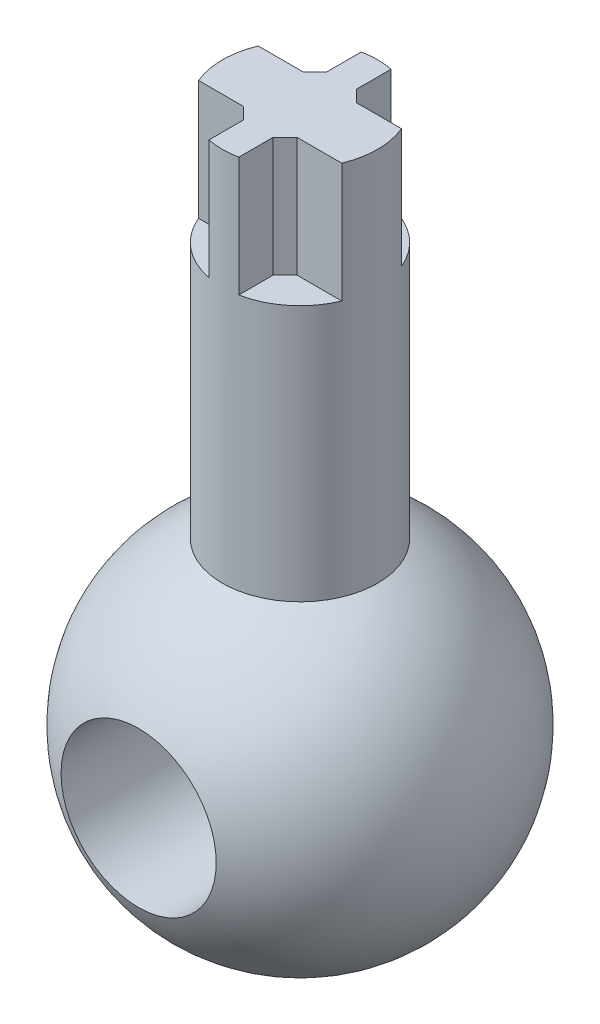
ISO-10303-21;
HEADER;
FILE_DESCRIPTION(('STEP AP214'),'2;1');
FILE_NAME('part.step','',(''),(''),'','','');
FILE_SCHEMA(('AUTOMOTIVE_DESIGN { 1 0 10303 214 1 1 1 1 }'));
ENDSEC;
DATA;
#1=APPLICATION_CONTEXT('core data for automotive mechanical design processes');
#2=APPLICATION_PROTOCOL_DEFINITION('international standard','automotive_design',2000,#1);
#3=PRODUCT_CONTEXT('',#1,'mechanical');
#4=PRODUCT('Part','Part','',(#3));
#5=PRODUCT_RELATED_PRODUCT_CATEGORY('part','',(#4));
#6=PRODUCT_DEFINITION_FORMATION('','',#4);
#7=PRODUCT_DEFINITION_CONTEXT('part definition',#1,'design');
#8=PRODUCT_DEFINITION('design','',#6,#7);
#9=PRODUCT_DEFINITION_SHAPE('','',#8);
#10=(LENGTH_UNIT() NAMED_UNIT(*) SI_UNIT(.MILLI.,.METRE.));
#11=(NAMED_UNIT(*) PLANE_ANGLE_UNIT() SI_UNIT($,.RADIAN.));
#12=(NAMED_UNIT(*) SI_UNIT($,.STERADIAN.) SOLID_ANGLE_UNIT());
#13=UNCERTAINTY_MEASURE_WITH_UNIT(LENGTH_MEASURE(1.E-05),#10,'distance_accuracy_value','');
#14=(GEOMETRIC_REPRESENTATION_CONTEXT(3) GLOBAL_UNCERTAINTY_ASSIGNED_CONTEXT((#13)) GLOBAL_UNIT_ASSIGNED_CONTEXT((#10,
#11,#12)) REPRESENTATION_CONTEXT('',''));
#15=CARTESIAN_POINT('',(0.,0.,0.));
#16=DIRECTION('',(0.,0.,1.));
#17=DIRECTION('',(1.,0.,0.));
#18=AXIS2_PLACEMENT_3D('',#15,#16,#17);
#19=CARTESIAN_POINT('',(0.,0.,0.));
#20=DIRECTION('',(-1.,0.,0.));
#21=DIRECTION('',(0.,1.,0.));
#22=AXIS2_PLACEMENT_3D('',#19,#20,#21);
#23=SPHERICAL_SURFACE('',#22,15.);
#24=CARTESIAN_POINT('',(0.,0.,13.5185058345958));
#25=DIRECTION('',(0.,0.,-1.));
#26=DIRECTION('',(-1.,0.,0.));
#27=AXIS2_PLACEMENT_3D('',#24,#25,#26);
#28=CIRCLE('',#27,6.5);
#29=CARTESIAN_POINT('',(-6.5,0.,13.5185058345958));
#30=VERTEX_POINT('',#29);
#31=EDGE_CURVE('E41',#30,#30,#28,.T.);
#32=ORIENTED_EDGE('',*,*,#31,.T.);
#33=EDGE_LOOP('',(#32));
#34=FACE_BOUND('',#33,.T.);
#35=CARTESIAN_POINT('',(0.,0.,-13.5185058345958));
#36=DIRECTION('',(0.,0.,1.));
#37=DIRECTION('',(1.,0.,0.));
#38=AXIS2_PLACEMENT_3D('',#35,#36,#37);
#39=CIRCLE('',#38,6.5);
#40=CARTESIAN_POINT('',(6.5,0.,-13.5185058345958));
#41=VERTEX_POINT('',#40);
#42=EDGE_CURVE('E274',#41,#41,#39,.T.);
#43=ORIENTED_EDGE('',*,*,#42,.T.);
#44=EDGE_LOOP('',(#43));
#45=FACE_BOUND('',#44,.T.);
#46=CARTESIAN_POINT('',(0.,13.5185058345958,0.));
#47=DIRECTION('',(0.,-1.,0.));
#48=DIRECTION('',(0.,0.,-1.));
#49=AXIS2_PLACEMENT_3D('',#46,#47,#48);
#50=CIRCLE('',#49,6.5);
#51=CARTESIAN_POINT('',(0.,13.5185058345958,-6.5));
#52=VERTEX_POINT('',#51);
#53=EDGE_CURVE('E240',#52,#52,#50,.F.);
#54=ORIENTED_EDGE('',*,*,#53,.F.);
#55=EDGE_LOOP('',(#54));
#56=FACE_BOUND('',#55,.T.);
#57=ADVANCED_FACE('F37',(#34,#45,#56),#23,.T.);
#58=CARTESIAN_POINT('',(0.,45.,0.));
#59=DIRECTION('',(0.,-1.,0.));
#60=DIRECTION('',(0.,0.,-1.));
#61=AXIS2_PLACEMENT_3D('',#58,#59,#60);
#62=CYLINDRICAL_SURFACE('',#61,6.5);
#63=CARTESIAN_POINT('',(0.,35.,0.));
#64=DIRECTION('',(0.,1.,0.));
#65=DIRECTION('',(0.,0.,1.));
#66=AXIS2_PLACEMENT_3D('',#63,#64,#65);
#67=CIRCLE('',#66,6.5);
#68=CARTESIAN_POINT('',(-6.,35.,2.5));
#69=VERTEX_POINT('',#68);
#70=CARTESIAN_POINT('',(-1.25,35.,6.37867541108654));
#71=VERTEX_POINT('',#70);
#72=EDGE_CURVE('E186',#69,#71,#67,.T.);
#73=ORIENTED_EDGE('',*,*,#72,.F.);
#74=DIRECTION('',(0.,1.,0.));
#75=VECTOR('',#74,1.);
#76=CARTESIAN_POINT('',(-6.,35.,2.5));
#77=LINE('',#76,#75);
#78=CARTESIAN_POINT('',(-6.,45.,2.5));
#79=VERTEX_POINT('',#78);
#80=EDGE_CURVE('E198',#69,#79,#77,.T.);
#81=ORIENTED_EDGE('',*,*,#80,.T.);
#82=CARTESIAN_POINT('',(0.,45.,0.));
#83=DIRECTION('',(0.,1.,0.));
#84=DIRECTION('',(0.,0.,1.));
#85=AXIS2_PLACEMENT_3D('',#82,#83,#84);
#86=CIRCLE('',#85,6.5);
#87=CARTESIAN_POINT('',(-6.,45.,-2.5));
#88=VERTEX_POINT('',#87);
#89=EDGE_CURVE('E237',#88,#79,#86,.T.);
#90=ORIENTED_EDGE('',*,*,#89,.F.);
#91=DIRECTION('',(0.,1.,0.));
#92=VECTOR('',#91,1.);
#93=CARTESIAN_POINT('',(-6.,35.,-2.5));
#94=LINE('',#93,#92);
#95=CARTESIAN_POINT('',(-6.,35.,-2.5));
#96=VERTEX_POINT('',#95);
#97=EDGE_CURVE('E230',#96,#88,#94,.T.);
#98=ORIENTED_EDGE('',*,*,#97,.F.);
#99=CARTESIAN_POINT('',(0.,35.,0.));
#100=DIRECTION('',(0.,1.,0.));
#101=DIRECTION('',(0.,0.,1.));
#102=AXIS2_PLACEMENT_3D('',#99,#100,#101);
#103=CIRCLE('',#102,6.5);
#104=CARTESIAN_POINT('',(-1.25,35.,-6.37867541108654));
#105=VERTEX_POINT('',#104);
#106=EDGE_CURVE('E221',#105,#96,#103,.T.);
#107=ORIENTED_EDGE('',*,*,#106,.F.);
#108=DIRECTION('',(0.,1.,0.));
#109=VECTOR('',#108,1.);
#110=CARTESIAN_POINT('',(-1.25,35.,-6.37867541108654));
#111=LINE('',#110,#109);
#112=CARTESIAN_POINT('',(-1.25,45.,-6.37867541108654));
#113=VERTEX_POINT('',#112);
#114=EDGE_CURVE('E234',#105,#113,#111,.T.);
#115=ORIENTED_EDGE('',*,*,#114,.T.);
#116=CARTESIAN_POINT('',(1.25,45.,-6.37867541108654));
#117=VERTEX_POINT('',#116);
#118=EDGE_CURVE('E178',#117,#113,#86,.T.);
#119=ORIENTED_EDGE('',*,*,#118,.F.);
#120=DIRECTION('',(0.,1.,0.));
#121=VECTOR('',#120,1.);
#122=CARTESIAN_POINT('',(1.25,35.,-6.37867541108654));
#123=LINE('',#122,#121);
#124=CARTESIAN_POINT('',(1.25,35.,-6.37867541108654));
#125=VERTEX_POINT('',#124);
#126=EDGE_CURVE('E155',#125,#117,#123,.T.);
#127=ORIENTED_EDGE('',*,*,#126,.F.);
#128=CARTESIAN_POINT('',(0.,35.,0.));
#129=DIRECTION('',(0.,1.,0.));
#130=DIRECTION('',(0.,0.,1.));
#131=AXIS2_PLACEMENT_3D('',#128,#129,#130);
#132=CIRCLE('',#131,6.5);
#133=CARTESIAN_POINT('',(6.,35.,-2.5));
#134=VERTEX_POINT('',#133);
#135=EDGE_CURVE('E162',#134,#125,#132,.T.);
#136=ORIENTED_EDGE('',*,*,#135,.F.);
#137=DIRECTION('',(0.,1.,0.));
#138=VECTOR('',#137,1.);
#139=CARTESIAN_POINT('',(6.,35.,-2.5));
#140=LINE('',#139,#138);
#141=CARTESIAN_POINT('',(6.,45.,-2.5));
#142=VERTEX_POINT('',#141);
#143=EDGE_CURVE('E179',#134,#142,#140,.T.);
#144=ORIENTED_EDGE('',*,*,#143,.T.);
#145=CARTESIAN_POINT('',(6.,45.,2.5));
#146=VERTEX_POINT('',#145);
#147=EDGE_CURVE('E329',#146,#142,#86,.T.);
#148=ORIENTED_EDGE('',*,*,#147,.F.);
#149=DIRECTION('',(0.,1.,0.));
#150=VECTOR('',#149,1.);
#151=CARTESIAN_POINT('',(6.,35.,2.5));
#152=LINE('',#151,#150);
#153=CARTESIAN_POINT('',(6.,35.,2.5));
#154=VERTEX_POINT('',#153);
#155=EDGE_CURVE('E212',#154,#146,#152,.T.);
#156=ORIENTED_EDGE('',*,*,#155,.F.);
#157=CARTESIAN_POINT('',(0.,35.,0.));
#158=DIRECTION('',(0.,1.,0.));
#159=DIRECTION('',(0.,0.,1.));
#160=AXIS2_PLACEMENT_3D('',#157,#158,#159);
#161=CIRCLE('',#160,6.5);
#162=CARTESIAN_POINT('',(1.25,35.,6.37867541108654));
#163=VERTEX_POINT('',#162);
#164=EDGE_CURVE('E203',#163,#154,#161,.T.);
#165=ORIENTED_EDGE('',*,*,#164,.F.);
#166=DIRECTION('',(0.,1.,0.));
#167=VECTOR('',#166,1.);
#168=CARTESIAN_POINT('',(1.25,35.,6.37867541108654));
#169=LINE('',#168,#167);
#170=CARTESIAN_POINT('',(1.25,45.,6.37867541108654));
#171=VERTEX_POINT('',#170);
#172=EDGE_CURVE('E216',#163,#171,#169,.T.);
#173=ORIENTED_EDGE('',*,*,#172,.T.);
#174=CARTESIAN_POINT('',(-1.25,45.,6.37867541108654));
#175=VERTEX_POINT('',#174);
#176=EDGE_CURVE('E241',#175,#171,#86,.T.);
#177=ORIENTED_EDGE('',*,*,#176,.F.);
#178=DIRECTION('',(0.,1.,0.));
#179=VECTOR('',#178,1.);
#180=CARTESIAN_POINT('',(-1.25,35.,6.37867541108654));
#181=LINE('',#180,#179);
#182=EDGE_CURVE('E194',#71,#175,#181,.T.);
#183=ORIENTED_EDGE('',*,*,#182,.F.);
#184=EDGE_LOOP('',(#73,#81,#90,#98,#107,#115,#119,#127,#136,#144,#148,#156,#165,#173,#177,#183));
#185=FACE_BOUND('',#184,.T.);
#186=ORIENTED_EDGE('',*,*,#53,.T.);
#187=EDGE_LOOP('',(#186));
#188=FACE_BOUND('',#187,.T.);
#189=ADVANCED_FACE('F174',(#185,#188),#62,.T.);
#190=CARTESIAN_POINT('',(0.,45.,0.));
#191=DIRECTION('',(0.,1.,0.));
#192=DIRECTION('',(0.,0.,1.));
#193=AXIS2_PLACEMENT_3D('',#190,#191,#192);
#194=PLANE('',#193);
#195=DIRECTION('',(-1.,0.,0.));
#196=VECTOR('',#195,1.);
#197=CARTESIAN_POINT('',(-1.25,45.,2.5));
#198=LINE('',#197,#196);
#199=CARTESIAN_POINT('',(-2.25000000000002,45.,2.5));
#200=VERTEX_POINT('',#199);
#201=EDGE_CURVE('E190',#200,#79,#198,.T.);
#202=ORIENTED_EDGE('',*,*,#201,.F.);
#203=DIRECTION('',(-0.707106781186551,0.,-0.707106781186544));
#204=VECTOR('',#203,1.);
#205=CARTESIAN_POINT('',(-2.25000000000002,45.,2.5));
#206=LINE('',#205,#204);
#207=CARTESIAN_POINT('',(-1.25,45.,3.50000000000001));
#208=VERTEX_POINT('',#207);
#209=EDGE_CURVE('E11',#200,#208,#206,.F.);
#210=ORIENTED_EDGE('',*,*,#209,.T.);
#211=DIRECTION('',(0.,0.,-1.));
#212=VECTOR('',#211,1.);
#213=CARTESIAN_POINT('',(-1.25,45.,2.5));
#214=LINE('',#213,#212);
#215=EDGE_CURVE('E195',#175,#208,#214,.T.);
#216=ORIENTED_EDGE('',*,*,#215,.F.);
#217=ORIENTED_EDGE('',*,*,#176,.T.);
#218=DIRECTION('',(0.,0.,1.));
#219=VECTOR('',#218,1.);
#220=CARTESIAN_POINT('',(1.25,45.,2.5));
#221=LINE('',#220,#219);
#222=CARTESIAN_POINT('',(1.25,45.,3.50000000000002));
#223=VERTEX_POINT('',#222);
#224=EDGE_CURVE('E207',#223,#171,#221,.T.);
#225=ORIENTED_EDGE('',*,*,#224,.F.);
#226=DIRECTION('',(-0.707106781186544,0.,0.707106781186551));
#227=VECTOR('',#226,1.);
#228=CARTESIAN_POINT('',(1.25,45.,3.50000000000002));
#229=LINE('',#228,#227);
#230=CARTESIAN_POINT('',(2.25000000000001,45.,2.5));
#231=VERTEX_POINT('',#230);
#232=EDGE_CURVE('E46',#223,#231,#229,.F.);
#233=ORIENTED_EDGE('',*,*,#232,.T.);
#234=DIRECTION('',(-1.,0.,0.));
#235=VECTOR('',#234,1.);
#236=CARTESIAN_POINT('',(6.,45.,2.5));
#237=LINE('',#236,#235);
#238=EDGE_CURVE('E181',#146,#231,#237,.T.);
#239=ORIENTED_EDGE('',*,*,#238,.F.);
#240=ORIENTED_EDGE('',*,*,#147,.T.);
#241=DIRECTION('',(1.,0.,0.));
#242=VECTOR('',#241,1.);
#243=CARTESIAN_POINT('',(6.,45.,-2.5));
#244=LINE('',#243,#242);
#245=CARTESIAN_POINT('',(2.25000000000002,45.,-2.5));
#246=VERTEX_POINT('',#245);
#247=EDGE_CURVE('E170',#246,#142,#244,.T.);
#248=ORIENTED_EDGE('',*,*,#247,.F.);
#249=DIRECTION('',(0.707106781186551,0.,0.707106781186544));
#250=VECTOR('',#249,1.);
#251=CARTESIAN_POINT('',(2.25000000000002,45.,-2.5));
#252=LINE('',#251,#250);
#253=CARTESIAN_POINT('',(1.25,45.,-3.50000000000001));
#254=VERTEX_POINT('',#253);
#255=EDGE_CURVE('E272',#246,#254,#252,.F.);
#256=ORIENTED_EDGE('',*,*,#255,.T.);
#257=DIRECTION('',(0.,0.,1.));
#258=VECTOR('',#257,1.);
#259=CARTESIAN_POINT('',(1.25,45.,-6.37867541108654));
#260=LINE('',#259,#258);
#261=EDGE_CURVE('E201',#117,#254,#260,.T.);
#262=ORIENTED_EDGE('',*,*,#261,.F.);
#263=ORIENTED_EDGE('',*,*,#118,.T.);
#264=DIRECTION('',(0.,0.,-1.));
#265=VECTOR('',#264,1.);
#266=CARTESIAN_POINT('',(-1.25,45.,-6.37867541108654));
#267=LINE('',#266,#265);
#268=CARTESIAN_POINT('',(-1.25,45.,-3.50000000000002));
#269=VERTEX_POINT('',#268);
#270=EDGE_CURVE('E225',#269,#113,#267,.T.);
#271=ORIENTED_EDGE('',*,*,#270,.F.);
#272=DIRECTION('',(0.707106781186544,0.,-0.707106781186551));
#273=VECTOR('',#272,1.);
#274=CARTESIAN_POINT('',(-1.25,45.,-3.50000000000002));
#275=LINE('',#274,#273);
#276=CARTESIAN_POINT('',(-2.25000000000001,45.,-2.5));
#277=VERTEX_POINT('',#276);
#278=EDGE_CURVE('E270',#269,#277,#275,.F.);
#279=ORIENTED_EDGE('',*,*,#278,.T.);
#280=DIRECTION('',(1.,0.,0.));
#281=VECTOR('',#280,1.);
#282=CARTESIAN_POINT('',(-1.25,45.,-2.5));
#283=LINE('',#282,#281);
#284=EDGE_CURVE('E219',#88,#277,#283,.T.);
#285=ORIENTED_EDGE('',*,*,#284,.F.);
#286=ORIENTED_EDGE('',*,*,#89,.T.);
#287=EDGE_LOOP('',(#202,#210,#216,#217,#225,#233,#239,#240,#248,#256,#262,#263,#271,#279,#285,#286));
#288=FACE_BOUND('',#287,.T.);
#289=ADVANCED_FACE('F297',(#288),#194,.T.);
#290=CARTESIAN_POINT('',(-1.25,35.,-6.37867541108654));
#291=DIRECTION('',(1.,0.,0.));
#292=DIRECTION('',(0.,0.,-1.));
#293=AXIS2_PLACEMENT_3D('',#290,#291,#292);
#294=PLANE('',#293);
#295=DIRECTION('',(0.,0.,-1.));
#296=VECTOR('',#295,1.);
#297=CARTESIAN_POINT('',(-1.25,35.,-6.37867541108654));
#298=LINE('',#297,#296);
#299=CARTESIAN_POINT('',(-1.25,35.,-3.50000000000002));
#300=VERTEX_POINT('',#299);
#301=EDGE_CURVE('E228',#300,#105,#298,.T.);
#302=ORIENTED_EDGE('',*,*,#301,.F.);
#303=DIRECTION('',(0.,1.,0.));
#304=VECTOR('',#303,1.);
#305=CARTESIAN_POINT('',(-1.25,45.,-3.50000000000002));
#306=LINE('',#305,#304);
#307=EDGE_CURVE('E244',#300,#269,#306,.T.);
#308=ORIENTED_EDGE('',*,*,#307,.T.);
#309=ORIENTED_EDGE('',*,*,#270,.T.);
#310=ORIENTED_EDGE('',*,*,#114,.F.);
#311=EDGE_LOOP('',(#302,#308,#309,#310));
#312=FACE_BOUND('',#311,.T.);
#313=ADVANCED_FACE('F341',(#312),#294,.F.);
#314=CARTESIAN_POINT('',(-1.25,35.,-2.5));
#315=DIRECTION('',(0.,0.,1.));
#316=DIRECTION('',(1.,0.,0.));
#317=AXIS2_PLACEMENT_3D('',#314,#315,#316);
#318=PLANE('',#317);
#319=ORIENTED_EDGE('',*,*,#284,.T.);
#320=DIRECTION('',(0.,-1.,0.));
#321=VECTOR('',#320,1.);
#322=CARTESIAN_POINT('',(-2.25000000000001,35.,-2.5));
#323=LINE('',#322,#321);
#324=CARTESIAN_POINT('',(-2.25000000000001,35.,-2.5));
#325=VERTEX_POINT('',#324);
#326=EDGE_CURVE('E247',#277,#325,#323,.T.);
#327=ORIENTED_EDGE('',*,*,#326,.T.);
#328=DIRECTION('',(1.,0.,0.));
#329=VECTOR('',#328,1.);
#330=CARTESIAN_POINT('',(-1.25,35.,-2.5));
#331=LINE('',#330,#329);
#332=EDGE_CURVE('E224',#96,#325,#331,.T.);
#333=ORIENTED_EDGE('',*,*,#332,.F.);
#334=ORIENTED_EDGE('',*,*,#97,.T.);
#335=EDGE_LOOP('',(#319,#327,#333,#334));
#336=FACE_BOUND('',#335,.T.);
#337=ADVANCED_FACE('F348',(#336),#318,.F.);
#338=CARTESIAN_POINT('',(0.,35.,0.));
#339=DIRECTION('',(0.,1.,0.));
#340=DIRECTION('',(0.,0.,1.));
#341=AXIS2_PLACEMENT_3D('',#338,#339,#340);
#342=PLANE('',#341);
#343=ORIENTED_EDGE('',*,*,#332,.T.);
#344=DIRECTION('',(-0.707106781186544,0.,0.707106781186551));
#345=VECTOR('',#344,1.);
#346=CARTESIAN_POINT('',(-2.37500000000002,35.,-2.37499999999999));
#347=LINE('',#346,#345);
#348=EDGE_CURVE('E249',#325,#300,#347,.F.);
#349=ORIENTED_EDGE('',*,*,#348,.T.);
#350=ORIENTED_EDGE('',*,*,#301,.T.);
#351=ORIENTED_EDGE('',*,*,#106,.T.);
#352=EDGE_LOOP('',(#343,#349,#350,#351));
#353=FACE_BOUND('',#352,.T.);
#354=ADVANCED_FACE('F371',(#353),#342,.T.);
#355=CARTESIAN_POINT('',(1.25,35.,2.5));
#356=DIRECTION('',(-1.,0.,0.));
#357=DIRECTION('',(0.,0.,1.));
#358=AXIS2_PLACEMENT_3D('',#355,#356,#357);
#359=PLANE('',#358);
#360=DIRECTION('',(0.,0.,1.));
#361=VECTOR('',#360,1.);
#362=CARTESIAN_POINT('',(1.25,35.,2.5));
#363=LINE('',#362,#361);
#364=CARTESIAN_POINT('',(1.25,35.,3.50000000000002));
#365=VERTEX_POINT('',#364);
#366=EDGE_CURVE('E210',#365,#163,#363,.T.);
#367=ORIENTED_EDGE('',*,*,#366,.F.);
#368=DIRECTION('',(0.,1.,0.));
#369=VECTOR('',#368,1.);
#370=CARTESIAN_POINT('',(1.25,45.,3.50000000000002));
#371=LINE('',#370,#369);
#372=EDGE_CURVE('E257',#365,#223,#371,.T.);
#373=ORIENTED_EDGE('',*,*,#372,.T.);
#374=ORIENTED_EDGE('',*,*,#224,.T.);
#375=ORIENTED_EDGE('',*,*,#172,.F.);
#376=EDGE_LOOP('',(#367,#373,#374,#375));
#377=FACE_BOUND('',#376,.T.);
#378=ADVANCED_FACE('F321',(#377),#359,.F.);
#379=CARTESIAN_POINT('',(6.,35.,2.5));
#380=DIRECTION('',(0.,0.,-1.));
#381=DIRECTION('',(-1.,0.,0.));
#382=AXIS2_PLACEMENT_3D('',#379,#380,#381);
#383=PLANE('',#382);
#384=ORIENTED_EDGE('',*,*,#238,.T.);
#385=DIRECTION('',(0.,-1.,0.));
#386=VECTOR('',#385,1.);
#387=CARTESIAN_POINT('',(2.25000000000001,35.,2.5));
#388=LINE('',#387,#386);
#389=CARTESIAN_POINT('',(2.25000000000001,35.,2.5));
#390=VERTEX_POINT('',#389);
#391=EDGE_CURVE('E260',#231,#390,#388,.T.);
#392=ORIENTED_EDGE('',*,*,#391,.T.);
#393=DIRECTION('',(-1.,0.,0.));
#394=VECTOR('',#393,1.);
#395=CARTESIAN_POINT('',(6.,35.,2.5));
#396=LINE('',#395,#394);
#397=EDGE_CURVE('E206',#154,#390,#396,.T.);
#398=ORIENTED_EDGE('',*,*,#397,.F.);
#399=ORIENTED_EDGE('',*,*,#155,.T.);
#400=EDGE_LOOP('',(#384,#392,#398,#399));
#401=FACE_BOUND('',#400,.T.);
#402=ADVANCED_FACE('F332',(#401),#383,.F.);
#403=CARTESIAN_POINT('',(0.,35.,0.));
#404=DIRECTION('',(0.,1.,0.));
#405=DIRECTION('',(0.,0.,1.));
#406=AXIS2_PLACEMENT_3D('',#403,#404,#405);
#407=PLANE('',#406);
#408=ORIENTED_EDGE('',*,*,#397,.T.);
#409=DIRECTION('',(0.707106781186544,0.,-0.707106781186551));
#410=VECTOR('',#409,1.);
#411=CARTESIAN_POINT('',(2.37500000000002,35.,2.37499999999999));
#412=LINE('',#411,#410);
#413=EDGE_CURVE('E262',#390,#365,#412,.F.);
#414=ORIENTED_EDGE('',*,*,#413,.T.);
#415=ORIENTED_EDGE('',*,*,#366,.T.);
#416=ORIENTED_EDGE('',*,*,#164,.T.);
#417=EDGE_LOOP('',(#408,#414,#415,#416));
#418=FACE_BOUND('',#417,.T.);
#419=ADVANCED_FACE('F318',(#418),#407,.T.);
#420=CARTESIAN_POINT('',(6.,35.,-2.5));
#421=DIRECTION('',(0.,0.,1.));
#422=DIRECTION('',(1.,0.,0.));
#423=AXIS2_PLACEMENT_3D('',#420,#421,#422);
#424=PLANE('',#423);
#425=DIRECTION('',(1.,0.,0.));
#426=VECTOR('',#425,1.);
#427=CARTESIAN_POINT('',(6.,35.,-2.5));
#428=LINE('',#427,#426);
#429=CARTESIAN_POINT('',(2.25000000000002,35.,-2.5));
#430=VERTEX_POINT('',#429);
#431=EDGE_CURVE('E161',#430,#134,#428,.T.);
#432=ORIENTED_EDGE('',*,*,#431,.F.);
#433=DIRECTION('',(0.,1.,0.));
#434=VECTOR('',#433,1.);
#435=CARTESIAN_POINT('',(2.25000000000002,45.,-2.5));
#436=LINE('',#435,#434);
#437=EDGE_CURVE('E251',#430,#246,#436,.T.);
#438=ORIENTED_EDGE('',*,*,#437,.T.);
#439=ORIENTED_EDGE('',*,*,#247,.T.);
#440=ORIENTED_EDGE('',*,*,#143,.F.);
#441=EDGE_LOOP('',(#432,#438,#439,#440));
#442=FACE_BOUND('',#441,.T.);
#443=ADVANCED_FACE('F368',(#442),#424,.F.);
#444=CARTESIAN_POINT('',(1.25,35.,-6.37867541108654));
#445=DIRECTION('',(-1.,0.,0.));
#446=DIRECTION('',(0.,0.,1.));
#447=AXIS2_PLACEMENT_3D('',#444,#445,#446);
#448=PLANE('',#447);
#449=ORIENTED_EDGE('',*,*,#261,.T.);
#450=DIRECTION('',(0.,-1.,0.));
#451=VECTOR('',#450,1.);
#452=CARTESIAN_POINT('',(1.25,35.,-3.50000000000001));
#453=LINE('',#452,#451);
#454=CARTESIAN_POINT('',(1.25,35.,-3.50000000000001));
#455=VERTEX_POINT('',#454);
#456=EDGE_CURVE('E158',#254,#455,#453,.T.);
#457=ORIENTED_EDGE('',*,*,#456,.T.);
#458=DIRECTION('',(0.,0.,1.));
#459=VECTOR('',#458,1.);
#460=CARTESIAN_POINT('',(1.25,35.,-6.37867541108654));
#461=LINE('',#460,#459);
#462=EDGE_CURVE('E150',#125,#455,#461,.T.);
#463=ORIENTED_EDGE('',*,*,#462,.F.);
#464=ORIENTED_EDGE('',*,*,#126,.T.);
#465=EDGE_LOOP('',(#449,#457,#463,#464));
#466=FACE_BOUND('',#465,.T.);
#467=ADVANCED_FACE('F153',(#466),#448,.F.);
#468=CARTESIAN_POINT('',(0.,35.,0.));
#469=DIRECTION('',(0.,1.,0.));
#470=DIRECTION('',(0.,0.,1.));
#471=AXIS2_PLACEMENT_3D('',#468,#469,#470);
#472=PLANE('',#471);
#473=ORIENTED_EDGE('',*,*,#462,.T.);
#474=DIRECTION('',(-0.707106781186551,0.,-0.707106781186544));
#475=VECTOR('',#474,1.);
#476=CARTESIAN_POINT('',(2.375,35.,-2.37500000000002));
#477=LINE('',#476,#475);
#478=EDGE_CURVE('E255',#455,#430,#477,.F.);
#479=ORIENTED_EDGE('',*,*,#478,.T.);
#480=ORIENTED_EDGE('',*,*,#431,.T.);
#481=ORIENTED_EDGE('',*,*,#135,.T.);
#482=EDGE_LOOP('',(#473,#479,#480,#481));
#483=FACE_BOUND('',#482,.T.);
#484=ADVANCED_FACE('F165',(#483),#472,.T.);
#485=CARTESIAN_POINT('',(-1.25,35.,2.5));
#486=DIRECTION('',(0.,0.,-1.));
#487=DIRECTION('',(-1.,0.,0.));
#488=AXIS2_PLACEMENT_3D('',#485,#486,#487);
#489=PLANE('',#488);
#490=DIRECTION('',(-1.,0.,0.));
#491=VECTOR('',#490,1.);
#492=CARTESIAN_POINT('',(-1.25,35.,2.5));
#493=LINE('',#492,#491);
#494=CARTESIAN_POINT('',(-2.25000000000002,35.,2.5));
#495=VERTEX_POINT('',#494);
#496=EDGE_CURVE('E192',#495,#69,#493,.T.);
#497=ORIENTED_EDGE('',*,*,#496,.F.);
#498=DIRECTION('',(0.,1.,0.));
#499=VECTOR('',#498,1.);
#500=CARTESIAN_POINT('',(-2.25000000000002,45.,2.5));
#501=LINE('',#500,#499);
#502=EDGE_CURVE('E264',#495,#200,#501,.T.);
#503=ORIENTED_EDGE('',*,*,#502,.T.);
#504=ORIENTED_EDGE('',*,*,#201,.T.);
#505=ORIENTED_EDGE('',*,*,#80,.F.);
#506=EDGE_LOOP('',(#497,#503,#504,#505));
#507=FACE_BOUND('',#506,.T.);
#508=ADVANCED_FACE('F352',(#507),#489,.F.);
#509=CARTESIAN_POINT('',(-1.25,35.,2.5));
#510=DIRECTION('',(1.,0.,0.));
#511=DIRECTION('',(0.,0.,-1.));
#512=AXIS2_PLACEMENT_3D('',#509,#510,#511);
#513=PLANE('',#512);
#514=ORIENTED_EDGE('',*,*,#215,.T.);
#515=DIRECTION('',(0.,-1.,0.));
#516=VECTOR('',#515,1.);
#517=CARTESIAN_POINT('',(-1.25,35.,3.50000000000001));
#518=LINE('',#517,#516);
#519=CARTESIAN_POINT('',(-1.25,35.,3.50000000000001));
#520=VERTEX_POINT('',#519);
#521=EDGE_CURVE('E54',#208,#520,#518,.T.);
#522=ORIENTED_EDGE('',*,*,#521,.T.);
#523=DIRECTION('',(0.,0.,-1.));
#524=VECTOR('',#523,1.);
#525=CARTESIAN_POINT('',(-1.25,35.,2.5));
#526=LINE('',#525,#524);
#527=EDGE_CURVE('E189',#71,#520,#526,.T.);
#528=ORIENTED_EDGE('',*,*,#527,.F.);
#529=ORIENTED_EDGE('',*,*,#182,.T.);
#530=EDGE_LOOP('',(#514,#522,#528,#529));
#531=FACE_BOUND('',#530,.T.);
#532=ADVANCED_FACE('F356',(#531),#513,.F.);
#533=CARTESIAN_POINT('',(0.,35.,0.));
#534=DIRECTION('',(0.,1.,0.));
#535=DIRECTION('',(0.,0.,1.));
#536=AXIS2_PLACEMENT_3D('',#533,#534,#535);
#537=PLANE('',#536);
#538=ORIENTED_EDGE('',*,*,#527,.T.);
#539=DIRECTION('',(0.707106781186551,0.,0.707106781186544));
#540=VECTOR('',#539,1.);
#541=CARTESIAN_POINT('',(-2.375,35.,2.37500000000002));
#542=LINE('',#541,#540);
#543=EDGE_CURVE('E268',#520,#495,#542,.F.);
#544=ORIENTED_EDGE('',*,*,#543,.T.);
#545=ORIENTED_EDGE('',*,*,#496,.T.);
#546=ORIENTED_EDGE('',*,*,#72,.T.);
#547=EDGE_LOOP('',(#538,#544,#545,#546));
#548=FACE_BOUND('',#547,.T.);
#549=ADVANCED_FACE('F305',(#548),#537,.T.);
#550=CARTESIAN_POINT('',(-1.25,35.,-3.50000000000002));
#551=DIRECTION('',(-0.707106781186551,0.,-0.707106781186544));
#552=DIRECTION('',(-0.707106781186544,0.,0.707106781186551));
#553=AXIS2_PLACEMENT_3D('',#550,#551,#552);
#554=PLANE('',#553);
#555=ORIENTED_EDGE('',*,*,#348,.F.);
#556=ORIENTED_EDGE('',*,*,#326,.F.);
#557=ORIENTED_EDGE('',*,*,#278,.F.);
#558=ORIENTED_EDGE('',*,*,#307,.F.);
#559=EDGE_LOOP('',(#555,#556,#557,#558));
#560=FACE_BOUND('',#559,.T.);
#561=ADVANCED_FACE('F301',(#560),#554,.T.);
#562=CARTESIAN_POINT('',(2.25000000000002,35.,-2.5));
#563=DIRECTION('',(0.707106781186544,0.,-0.707106781186551));
#564=DIRECTION('',(-0.707106781186551,0.,-0.707106781186544));
#565=AXIS2_PLACEMENT_3D('',#562,#563,#564);
#566=PLANE('',#565);
#567=ORIENTED_EDGE('',*,*,#478,.F.);
#568=ORIENTED_EDGE('',*,*,#456,.F.);
#569=ORIENTED_EDGE('',*,*,#255,.F.);
#570=ORIENTED_EDGE('',*,*,#437,.F.);
#571=EDGE_LOOP('',(#567,#568,#569,#570));
#572=FACE_BOUND('',#571,.T.);
#573=ADVANCED_FACE('F304',(#572),#566,.T.);
#574=CARTESIAN_POINT('',(1.25,35.,3.50000000000002));
#575=DIRECTION('',(0.707106781186551,0.,0.707106781186544));
#576=DIRECTION('',(0.707106781186544,0.,-0.707106781186551));
#577=AXIS2_PLACEMENT_3D('',#574,#575,#576);
#578=PLANE('',#577);
#579=ORIENTED_EDGE('',*,*,#413,.F.);
#580=ORIENTED_EDGE('',*,*,#391,.F.);
#581=ORIENTED_EDGE('',*,*,#232,.F.);
#582=ORIENTED_EDGE('',*,*,#372,.F.);
#583=EDGE_LOOP('',(#579,#580,#581,#582));
#584=FACE_BOUND('',#583,.T.);
#585=ADVANCED_FACE('F289',(#584),#578,.T.);
#586=CARTESIAN_POINT('',(-2.25000000000002,35.,2.5));
#587=DIRECTION('',(-0.707106781186544,0.,0.707106781186551));
#588=DIRECTION('',(0.707106781186551,0.,0.707106781186544));
#589=AXIS2_PLACEMENT_3D('',#586,#587,#588);
#590=PLANE('',#589);
#591=ORIENTED_EDGE('',*,*,#543,.F.);
#592=ORIENTED_EDGE('',*,*,#521,.F.);
#593=ORIENTED_EDGE('',*,*,#209,.F.);
#594=ORIENTED_EDGE('',*,*,#502,.F.);
#595=EDGE_LOOP('',(#591,#592,#593,#594));
#596=FACE_BOUND('',#595,.T.);
#597=ADVANCED_FACE('F39',(#596),#590,.T.);
#598=CARTESIAN_POINT('',(0.,0.,-15.));
#599=DIRECTION('',(0.,0.,1.));
#600=DIRECTION('',(1.,0.,0.));
#601=AXIS2_PLACEMENT_3D('',#598,#599,#600);
#602=CYLINDRICAL_SURFACE('',#601,6.5);
#603=ORIENTED_EDGE('',*,*,#42,.F.);
#604=EDGE_LOOP('',(#603));
#605=FACE_BOUND('',#604,.T.);
#606=ORIENTED_EDGE('',*,*,#31,.F.);
#607=EDGE_LOOP('',(#606));
#608=FACE_BOUND('',#607,.T.);
#609=ADVANCED_FACE('F282',(#605,#608),#602,.F.);
#610=CLOSED_SHELL('',(#57,#189,#289,#313,#337,#354,#378,#402,#419,#443,#467,#484,#508,#532,#549,
#561,#573,#585,#597,#609));
#611=MANIFOLD_SOLID_BREP('B2',#610);
#612=ADVANCED_BREP_SHAPE_REPRESENTATION('',(#18,#611),#14);
#613=SHAPE_DEFINITION_REPRESENTATION(#9,#612);
ENDSEC;
END-ISO-10303-21;
